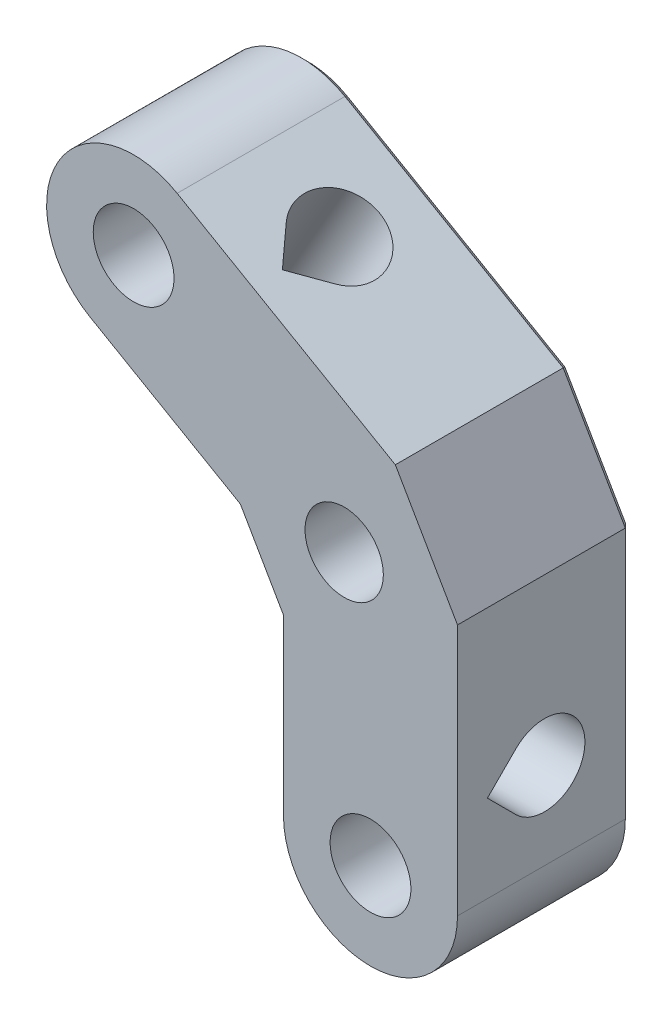
ISO-10303-21;
HEADER;
FILE_DESCRIPTION(('STEP AP214'),'2;1');
FILE_NAME('part.step','',(''),(''),'','','');
FILE_SCHEMA(('AUTOMOTIVE_DESIGN { 1 0 10303 214 1 1 1 1 }'));
ENDSEC;
DATA;
#1=APPLICATION_CONTEXT('core data for automotive mechanical design processes');
#2=APPLICATION_PROTOCOL_DEFINITION('international standard','automotive_design',2000,#1);
#3=PRODUCT_CONTEXT('',#1,'mechanical');
#4=PRODUCT('Part','Part','',(#3));
#5=PRODUCT_RELATED_PRODUCT_CATEGORY('part','',(#4));
#6=PRODUCT_DEFINITION_FORMATION('','',#4);
#7=PRODUCT_DEFINITION_CONTEXT('part definition',#1,'design');
#8=PRODUCT_DEFINITION('design','',#6,#7);
#9=PRODUCT_DEFINITION_SHAPE('','',#8);
#10=(LENGTH_UNIT() NAMED_UNIT(*) SI_UNIT(.MILLI.,.METRE.));
#11=(NAMED_UNIT(*) PLANE_ANGLE_UNIT() SI_UNIT($,.RADIAN.));
#12=(NAMED_UNIT(*) SI_UNIT($,.STERADIAN.) SOLID_ANGLE_UNIT());
#13=UNCERTAINTY_MEASURE_WITH_UNIT(LENGTH_MEASURE(1.E-05),#10,'distance_accuracy_value','');
#14=(GEOMETRIC_REPRESENTATION_CONTEXT(3) GLOBAL_UNCERTAINTY_ASSIGNED_CONTEXT((#13)) GLOBAL_UNIT_ASSIGNED_CONTEXT((#10,
#11,#12)) REPRESENTATION_CONTEXT('',''));
#15=CARTESIAN_POINT('',(0.,0.,0.));
#16=DIRECTION('',(0.,0.,1.));
#17=DIRECTION('',(1.,0.,0.));
#18=AXIS2_PLACEMENT_3D('',#15,#16,#17);
#19=CARTESIAN_POINT('',(1.76659838198365E-13,2.35810055605255E-13,0.));
#20=DIRECTION('',(0.,0.,1.));
#21=DIRECTION('',(1.,0.,0.));
#22=AXIS2_PLACEMENT_3D('',#19,#20,#21);
#23=CYLINDRICAL_SURFACE('',#22,7.);
#24=DIRECTION('',(0.,0.,1.));
#25=VECTOR('',#24,1.);
#26=CARTESIAN_POINT('',(-6.99999999999982,2.35810055605255E-13,0.));
#27=LINE('',#26,#25);
#28=CARTESIAN_POINT('',(-6.99999999999982,2.35810055605255E-13,0.5));
#29=VERTEX_POINT('',#28);
#30=CARTESIAN_POINT('',(-6.99999999999982,2.35810055605255E-13,14.));
#31=VERTEX_POINT('',#30);
#32=EDGE_CURVE('E244',#29,#31,#27,.T.);
#33=ORIENTED_EDGE('',*,*,#32,.F.);
#34=CARTESIAN_POINT('',(1.76659838198365E-13,2.35810055605255E-13,0.5));
#35=DIRECTION('',(0.,0.,1.));
#36=DIRECTION('',(1.,0.,0.));
#37=AXIS2_PLACEMENT_3D('',#34,#35,#36);
#38=CIRCLE('',#37,7.);
#39=CARTESIAN_POINT('',(7.00000000000018,2.35810055605255E-13,0.5));
#40=VERTEX_POINT('',#39);
#41=EDGE_CURVE('E297',#29,#40,#38,.T.);
#42=ORIENTED_EDGE('',*,*,#41,.T.);
#43=DIRECTION('',(0.,0.,1.));
#44=VECTOR('',#43,1.);
#45=CARTESIAN_POINT('',(7.00000000000018,2.35810055605255E-13,0.));
#46=LINE('',#45,#44);
#47=CARTESIAN_POINT('',(7.00000000000018,2.35810055605255E-13,14.));
#48=VERTEX_POINT('',#47);
#49=EDGE_CURVE('E243',#40,#48,#46,.T.);
#50=ORIENTED_EDGE('',*,*,#49,.T.);
#51=CARTESIAN_POINT('',(1.76659838198365E-13,2.35810055605255E-13,14.));
#52=DIRECTION('',(0.,0.,1.));
#53=DIRECTION('',(1.,0.,0.));
#54=AXIS2_PLACEMENT_3D('',#51,#52,#53);
#55=CIRCLE('',#54,7.);
#56=EDGE_CURVE('E219',#31,#48,#55,.T.);
#57=ORIENTED_EDGE('',*,*,#56,.F.);
#58=EDGE_LOOP('',(#33,#42,#50,#57));
#59=FACE_BOUND('',#58,.T.);
#60=ADVANCED_FACE('F34',(#59),#23,.T.);
#61=CARTESIAN_POINT('',(-6.9999999999999,13.9585481156721,0.));
#62=DIRECTION('',(-1.,0.,0.));
#63=DIRECTION('',(0.,-1.,0.));
#64=AXIS2_PLACEMENT_3D('',#61,#62,#63);
#65=PLANE('',#64);
#66=CARTESIAN_POINT('',(-6.99999999999982,6.99999999999998,7.));
#67=DIRECTION('',(-1.,0.,0.));
#68=DIRECTION('',(0.,-1.,0.));
#69=AXIS2_PLACEMENT_3D('',#66,#67,#68);
#70=CIRCLE('',#69,3.25);
#71=CARTESIAN_POINT('',(-6.99999999999982,9.29809703885623,9.29809703885627));
#72=VERTEX_POINT('',#71);
#73=CARTESIAN_POINT('',(-6.99999999999985,4.70190296114367,9.29809703885628));
#74=VERTEX_POINT('',#73);
#75=EDGE_CURVE('E169',#72,#74,#70,.T.);
#76=ORIENTED_EDGE('',*,*,#75,.F.);
#77=DIRECTION('',(0.,0.707106781186546,-0.707106781186549));
#78=VECTOR('',#77,1.);
#79=CARTESIAN_POINT('',(-6.99999999999982,6.99999999999995,11.5961940777126));
#80=LINE('',#79,#78);
#81=CARTESIAN_POINT('',(-6.99999999999982,6.99999999999995,11.5961940777126));
#82=VERTEX_POINT('',#81);
#83=EDGE_CURVE('E184',#82,#72,#80,.T.);
#84=ORIENTED_EDGE('',*,*,#83,.F.);
#85=DIRECTION('',(0.,0.707106781186549,0.707106781186546));
#86=VECTOR('',#85,1.);
#87=CARTESIAN_POINT('',(-6.99999999999982,4.70190296114367,9.29809703885628));
#88=LINE('',#87,#86);
#89=EDGE_CURVE('E187',#74,#82,#88,.T.);
#90=ORIENTED_EDGE('',*,*,#89,.F.);
#91=EDGE_LOOP('',(#76,#84,#90));
#92=FACE_BOUND('',#91,.T.);
#93=DIRECTION('',(0.,0.,1.));
#94=VECTOR('',#93,1.);
#95=CARTESIAN_POINT('',(-6.9999999999999,13.9585481156721,0.));
#96=LINE('',#95,#94);
#97=CARTESIAN_POINT('',(-6.9999999999999,13.9585481156721,0.500000000000001));
#98=VERTEX_POINT('',#97);
#99=CARTESIAN_POINT('',(-6.9999999999999,13.9585481156721,14.));
#100=VERTEX_POINT('',#99);
#101=EDGE_CURVE('E247',#98,#100,#96,.T.);
#102=ORIENTED_EDGE('',*,*,#101,.F.);
#103=DIRECTION('',(0.,-1.,0.));
#104=VECTOR('',#103,1.);
#105=CARTESIAN_POINT('',(-6.99999999999982,2.35810055605255E-13,0.5));
#106=LINE('',#105,#104);
#107=EDGE_CURVE('E299',#98,#29,#106,.T.);
#108=ORIENTED_EDGE('',*,*,#107,.T.);
#109=ORIENTED_EDGE('',*,*,#32,.T.);
#110=DIRECTION('',(0.,-1.,0.));
#111=VECTOR('',#110,1.);
#112=CARTESIAN_POINT('',(-6.9999999999999,13.9585481156721,14.));
#113=LINE('',#112,#111);
#114=EDGE_CURVE('E240',#100,#31,#113,.T.);
#115=ORIENTED_EDGE('',*,*,#114,.F.);
#116=EDGE_LOOP('',(#102,#108,#109,#115));
#117=FACE_BOUND('',#116,.T.);
#118=ADVANCED_FACE('F380',(#92,#117),#65,.T.);
#119=CARTESIAN_POINT('',(-10.4641016151382,19.9585481156731,0.));
#120=DIRECTION('',(-0.866025403784439,-0.5,0.));
#121=DIRECTION('',(0.5,-0.866025403784439,0.));
#122=AXIS2_PLACEMENT_3D('',#119,#120,#121);
#123=PLANE('',#122);
#124=DIRECTION('',(0.,0.,1.));
#125=VECTOR('',#124,1.);
#126=CARTESIAN_POINT('',(-10.4641016151382,19.9585481156731,0.));
#127=LINE('',#126,#125);
#128=CARTESIAN_POINT('',(-10.4641016151382,19.9585481156731,0.5));
#129=VERTEX_POINT('',#128);
#130=CARTESIAN_POINT('',(-10.4641016151382,19.9585481156731,14.));
#131=VERTEX_POINT('',#130);
#132=EDGE_CURVE('E249',#129,#131,#127,.T.);
#133=ORIENTED_EDGE('',*,*,#132,.F.);
#134=DIRECTION('',(0.5,-0.866025403784439,0.));
#135=VECTOR('',#134,1.);
#136=CARTESIAN_POINT('',(-6.9999999999999,13.9585481156721,0.500000000000001));
#137=LINE('',#136,#135);
#138=EDGE_CURVE('E301',#129,#98,#137,.T.);
#139=ORIENTED_EDGE('',*,*,#138,.T.);
#140=ORIENTED_EDGE('',*,*,#101,.T.);
#141=DIRECTION('',(0.5,-0.866025403784439,0.));
#142=VECTOR('',#141,1.);
#143=CARTESIAN_POINT('',(-10.4641016151382,19.9585481156731,14.));
#144=LINE('',#143,#142);
#145=EDGE_CURVE('E237',#131,#100,#144,.T.);
#146=ORIENTED_EDGE('',*,*,#145,.F.);
#147=EDGE_LOOP('',(#133,#139,#140,#146));
#148=FACE_BOUND('',#147,.T.);
#149=ADVANCED_FACE('F403',(#148),#123,.T.);
#150=CARTESIAN_POINT('',(-22.5525588832574,26.9378221735091,0.));
#151=DIRECTION('',(-0.500000000000008,-0.866025403784434,0.));
#152=DIRECTION('',(0.866025403784434,-0.500000000000008,0.));
#153=AXIS2_PLACEMENT_3D('',#150,#151,#152);
#154=PLANE('',#153);
#155=DIRECTION('',(-0.612372435695795,0.353553390593271,0.707106781186549));
#156=VECTOR('',#155,1.);
#157=CARTESIAN_POINT('',(-14.5000823158688,22.2887226596838,9.29809703885627));
#158=LINE('',#157,#156);
#159=CARTESIAN_POINT('',(-14.5000823158688,22.2887226596838,9.29809703885628));
#160=VERTEX_POINT('',#159);
#161=CARTESIAN_POINT('',(-16.49029273188,23.4377711791121,11.5961940777126));
#162=VERTEX_POINT('',#161);
#163=EDGE_CURVE('E197',#160,#162,#158,.T.);
#164=ORIENTED_EDGE('',*,*,#163,.F.);
#165=CARTESIAN_POINT('',(-16.4902927318801,23.4377711791119,7.));
#166=DIRECTION('',(-0.499999999999998,-0.86602540378444,0.));
#167=DIRECTION('',(0.86602540378444,-0.499999999999998,0.));
#168=AXIS2_PLACEMENT_3D('',#165,#166,#167);
#169=CIRCLE('',#168,3.25);
#170=CARTESIAN_POINT('',(-18.4805031478915,24.58681969854,9.29809703885628));
#171=VERTEX_POINT('',#170);
#172=EDGE_CURVE('E203',#171,#160,#169,.T.);
#173=ORIENTED_EDGE('',*,*,#172,.F.);
#174=DIRECTION('',(-0.612372435695796,0.353553390593272,-0.707106781186547));
#175=VECTOR('',#174,1.);
#176=CARTESIAN_POINT('',(-16.4902927318801,23.4377711791119,11.5961940777126));
#177=LINE('',#176,#175);
#178=EDGE_CURVE('E200',#162,#171,#177,.T.);
#179=ORIENTED_EDGE('',*,*,#178,.F.);
#180=EDGE_LOOP('',(#164,#173,#179));
#181=FACE_BOUND('',#180,.T.);
#182=DIRECTION('',(0.,0.,1.));
#183=VECTOR('',#182,1.);
#184=CARTESIAN_POINT('',(-22.5525588832574,26.9378221735091,0.));
#185=LINE('',#184,#183);
#186=CARTESIAN_POINT('',(-22.5525588832574,26.9378221735091,0.5));
#187=VERTEX_POINT('',#186);
#188=CARTESIAN_POINT('',(-22.5525588832574,26.9378221735091,14.));
#189=VERTEX_POINT('',#188);
#190=EDGE_CURVE('E251',#187,#189,#185,.T.);
#191=ORIENTED_EDGE('',*,*,#190,.F.);
#192=DIRECTION('',(0.866025403784434,-0.500000000000008,0.));
#193=VECTOR('',#192,1.);
#194=CARTESIAN_POINT('',(-10.4641016151382,19.9585481156731,0.5));
#195=LINE('',#194,#193);
#196=EDGE_CURVE('E303',#187,#129,#195,.T.);
#197=ORIENTED_EDGE('',*,*,#196,.T.);
#198=ORIENTED_EDGE('',*,*,#132,.T.);
#199=DIRECTION('',(0.866025403784434,-0.500000000000008,0.));
#200=VECTOR('',#199,1.);
#201=CARTESIAN_POINT('',(-22.5525588832574,26.9378221735091,14.));
#202=LINE('',#201,#200);
#203=EDGE_CURVE('E234',#189,#131,#202,.T.);
#204=ORIENTED_EDGE('',*,*,#203,.F.);
#205=EDGE_LOOP('',(#191,#197,#198,#204));
#206=FACE_BOUND('',#205,.T.);
#207=ADVANCED_FACE('F374',(#181,#206),#154,.T.);
#208=CARTESIAN_POINT('',(-19.0525588832574,33.0000000000002,0.));
#209=DIRECTION('',(0.,0.,1.));
#210=DIRECTION('',(1.,0.,0.));
#211=AXIS2_PLACEMENT_3D('',#208,#209,#210);
#212=CYLINDRICAL_SURFACE('',#211,7.);
#213=DIRECTION('',(0.,0.,1.));
#214=VECTOR('',#213,1.);
#215=CARTESIAN_POINT('',(-15.5525588832575,39.0621778264913,0.));
#216=LINE('',#215,#214);
#217=CARTESIAN_POINT('',(-15.5525588832575,39.0621778264913,0.500000000000002));
#218=VERTEX_POINT('',#217);
#219=CARTESIAN_POINT('',(-15.5525588832575,39.0621778264913,14.));
#220=VERTEX_POINT('',#219);
#221=EDGE_CURVE('E253',#218,#220,#216,.T.);
#222=ORIENTED_EDGE('',*,*,#221,.F.);
#223=CARTESIAN_POINT('',(-19.0525588832574,33.0000000000002,0.5));
#224=DIRECTION('',(0.,0.,1.));
#225=DIRECTION('',(1.,0.,0.));
#226=AXIS2_PLACEMENT_3D('',#223,#224,#225);
#227=CIRCLE('',#226,7.);
#228=EDGE_CURVE('E58',#218,#187,#227,.T.);
#229=ORIENTED_EDGE('',*,*,#228,.T.);
#230=ORIENTED_EDGE('',*,*,#190,.T.);
#231=CARTESIAN_POINT('',(-19.0525588832574,33.0000000000002,14.));
#232=DIRECTION('',(0.,0.,1.));
#233=DIRECTION('',(1.,0.,0.));
#234=AXIS2_PLACEMENT_3D('',#231,#232,#233);
#235=CIRCLE('',#234,7.);
#236=EDGE_CURVE('E231',#220,#189,#235,.T.);
#237=ORIENTED_EDGE('',*,*,#236,.F.);
#238=EDGE_LOOP('',(#222,#229,#230,#237));
#239=FACE_BOUND('',#238,.T.);
#240=ADVANCED_FACE('F371',(#239),#212,.T.);
#241=CARTESIAN_POINT('',(2.00000000000025,28.9282032302758,0.));
#242=DIRECTION('',(0.499999999999997,0.86602540378444,0.));
#243=DIRECTION('',(-0.866025403784441,0.499999999999997,0.));
#244=AXIS2_PLACEMENT_3D('',#241,#242,#243);
#245=PLANE('',#244);
#246=DIRECTION('',(0.612372435695795,-0.353553390593271,-0.707106781186549));
#247=VECTOR('',#246,1.);
#248=CARTESIAN_POINT('',(1.276152963317,29.346116511757,-0.835826562962364));
#249=LINE('',#248,#247);
#250=CARTESIAN_POINT('',(-9.49029273187996,35.5621268320944,11.5961940777126));
#251=VERTEX_POINT('',#250);
#252=CARTESIAN_POINT('',(-7.50008231586863,34.4130783126663,9.29809703885628));
#253=VERTEX_POINT('',#252);
#254=EDGE_CURVE('E264',#251,#253,#249,.T.);
#255=ORIENTED_EDGE('',*,*,#254,.F.);
#256=DIRECTION('',(0.612372435695796,-0.353553390593272,0.707106781186547));
#257=VECTOR('',#256,1.);
#258=CARTESIAN_POINT('',(-8.76644569519673,35.1442135506132,12.4320206406749));
#259=LINE('',#258,#257);
#260=CARTESIAN_POINT('',(-11.4805031478913,36.7111753515225,9.29809703885628));
#261=VERTEX_POINT('',#260);
#262=EDGE_CURVE('E246',#261,#251,#259,.T.);
#263=ORIENTED_EDGE('',*,*,#262,.F.);
#264=CARTESIAN_POINT('',(-9.49029273187996,35.5621268320944,7.));
#265=DIRECTION('',(0.499999999999997,0.86602540378444,0.));
#266=DIRECTION('',(-0.866025403784441,0.499999999999997,0.));
#267=AXIS2_PLACEMENT_3D('',#264,#265,#266);
#268=CIRCLE('',#267,3.25);
#269=EDGE_CURVE('E261',#253,#261,#268,.T.);
#270=ORIENTED_EDGE('',*,*,#269,.F.);
#271=EDGE_LOOP('',(#255,#263,#270));
#272=FACE_BOUND('',#271,.T.);
#273=DIRECTION('',(0.,0.,1.));
#274=VECTOR('',#273,1.);
#275=CARTESIAN_POINT('',(2.00000000000025,28.9282032302758,0.));
#276=LINE('',#275,#274);
#277=CARTESIAN_POINT('',(2.00000000000025,28.9282032302758,0.500000000000002));
#278=VERTEX_POINT('',#277);
#279=CARTESIAN_POINT('',(2.00000000000025,28.9282032302758,14.));
#280=VERTEX_POINT('',#279);
#281=EDGE_CURVE('E255',#278,#280,#276,.T.);
#282=ORIENTED_EDGE('',*,*,#281,.F.);
#283=DIRECTION('',(-0.866025403784441,0.499999999999997,0.));
#284=VECTOR('',#283,1.);
#285=CARTESIAN_POINT('',(-15.5525588832575,39.0621778264913,0.500000000000002));
#286=LINE('',#285,#284);
#287=EDGE_CURVE('E51',#278,#218,#286,.T.);
#288=ORIENTED_EDGE('',*,*,#287,.T.);
#289=ORIENTED_EDGE('',*,*,#221,.T.);
#290=DIRECTION('',(-0.86602540378444,0.499999999999997,0.));
#291=VECTOR('',#290,1.);
#292=CARTESIAN_POINT('',(2.00000000000025,28.9282032302758,14.));
#293=LINE('',#292,#291);
#294=EDGE_CURVE('E228',#280,#220,#293,.T.);
#295=ORIENTED_EDGE('',*,*,#294,.F.);
#296=EDGE_LOOP('',(#282,#288,#289,#295));
#297=FACE_BOUND('',#296,.T.);
#298=ADVANCED_FACE('F370',(#272,#297),#245,.T.);
#299=CARTESIAN_POINT('',(7.00000000000016,20.2679491924314,0.));
#300=DIRECTION('',(0.866025403784444,0.499999999999991,0.));
#301=DIRECTION('',(-0.499999999999991,0.866025403784444,0.));
#302=AXIS2_PLACEMENT_3D('',#299,#300,#301);
#303=PLANE('',#302);
#304=DIRECTION('',(0.,0.,1.));
#305=VECTOR('',#304,1.);
#306=CARTESIAN_POINT('',(7.00000000000016,20.2679491924314,0.));
#307=LINE('',#306,#305);
#308=CARTESIAN_POINT('',(7.00000000000016,20.2679491924314,0.5));
#309=VERTEX_POINT('',#308);
#310=CARTESIAN_POINT('',(7.00000000000016,20.2679491924314,14.));
#311=VERTEX_POINT('',#310);
#312=EDGE_CURVE('E257',#309,#311,#307,.T.);
#313=ORIENTED_EDGE('',*,*,#312,.F.);
#314=DIRECTION('',(-0.499999999999991,0.866025403784444,0.));
#315=VECTOR('',#314,1.);
#316=CARTESIAN_POINT('',(2.00000000000025,28.9282032302758,0.500000000000001));
#317=LINE('',#316,#315);
#318=EDGE_CURVE('E266',#309,#278,#317,.T.);
#319=ORIENTED_EDGE('',*,*,#318,.T.);
#320=ORIENTED_EDGE('',*,*,#281,.T.);
#321=DIRECTION('',(-0.499999999999991,0.866025403784444,0.));
#322=VECTOR('',#321,1.);
#323=CARTESIAN_POINT('',(7.00000000000016,20.2679491924314,14.));
#324=LINE('',#323,#322);
#325=EDGE_CURVE('E225',#311,#280,#324,.T.);
#326=ORIENTED_EDGE('',*,*,#325,.F.);
#327=EDGE_LOOP('',(#313,#319,#320,#326));
#328=FACE_BOUND('',#327,.T.);
#329=ADVANCED_FACE('F367',(#328),#303,.T.);
#330=CARTESIAN_POINT('',(7.00000000000018,2.35810055605255E-13,0.));
#331=DIRECTION('',(1.,0.,0.));
#332=DIRECTION('',(0.,1.,0.));
#333=AXIS2_PLACEMENT_3D('',#330,#331,#332);
#334=PLANE('',#333);
#335=CARTESIAN_POINT('',(7.00000000000018,6.99999999999998,7.));
#336=DIRECTION('',(-1.,0.,0.));
#337=DIRECTION('',(0.,-1.,0.));
#338=AXIS2_PLACEMENT_3D('',#335,#336,#337);
#339=CIRCLE('',#338,3.25);
#340=CARTESIAN_POINT('',(7.00000000000018,9.29809703885623,9.29809703885627));
#341=VERTEX_POINT('',#340);
#342=CARTESIAN_POINT('',(7.00000000000018,4.70190296114367,9.29809703885628));
#343=VERTEX_POINT('',#342);
#344=EDGE_CURVE('E166',#341,#343,#339,.T.);
#345=ORIENTED_EDGE('',*,*,#344,.T.);
#346=DIRECTION('',(0.,0.707106781186549,0.707106781186546));
#347=VECTOR('',#346,1.);
#348=CARTESIAN_POINT('',(7.00000000000018,4.70190296114367,9.29809703885628));
#349=LINE('',#348,#347);
#350=CARTESIAN_POINT('',(7.00000000000017,6.99999999999995,11.5961940777126));
#351=VERTEX_POINT('',#350);
#352=EDGE_CURVE('E178',#343,#351,#349,.T.);
#353=ORIENTED_EDGE('',*,*,#352,.T.);
#354=DIRECTION('',(0.,0.707106781186546,-0.707106781186549));
#355=VECTOR('',#354,1.);
#356=CARTESIAN_POINT('',(7.00000000000018,6.99999999999995,11.5961940777126));
#357=LINE('',#356,#355);
#358=EDGE_CURVE('E174',#351,#341,#357,.T.);
#359=ORIENTED_EDGE('',*,*,#358,.T.);
#360=EDGE_LOOP('',(#345,#353,#359));
#361=FACE_BOUND('',#360,.T.);
#362=ORIENTED_EDGE('',*,*,#49,.F.);
#363=DIRECTION('',(0.,1.,0.));
#364=VECTOR('',#363,1.);
#365=CARTESIAN_POINT('',(7.00000000000016,20.2679491924314,0.5));
#366=LINE('',#365,#364);
#367=EDGE_CURVE('E295',#40,#309,#366,.T.);
#368=ORIENTED_EDGE('',*,*,#367,.T.);
#369=ORIENTED_EDGE('',*,*,#312,.T.);
#370=DIRECTION('',(0.,1.,0.));
#371=VECTOR('',#370,1.);
#372=CARTESIAN_POINT('',(7.00000000000018,2.35810055605255E-13,14.));
#373=LINE('',#372,#371);
#374=EDGE_CURVE('E222',#48,#311,#373,.T.);
#375=ORIENTED_EDGE('',*,*,#374,.F.);
#376=EDGE_LOOP('',(#362,#368,#369,#375));
#377=FACE_BOUND('',#376,.T.);
#378=ADVANCED_FACE('F182',(#361,#377),#334,.T.);
#379=CARTESIAN_POINT('',(1.76659838198365E-13,2.35810055605255E-13,0.));
#380=DIRECTION('',(0.,0.,1.));
#381=DIRECTION('',(1.,0.,0.));
#382=AXIS2_PLACEMENT_3D('',#379,#380,#381);
#383=PLANE('',#382);
#384=DIRECTION('',(0.86602540378444,-0.499999999999997,0.));
#385=VECTOR('',#384,1.);
#386=CARTESIAN_POINT('',(1.75000000000024,28.4951905283836,0.));
#387=LINE('',#386,#385);
#388=CARTESIAN_POINT('',(-15.8025588832575,38.6291651245991,0.));
#389=VERTEX_POINT('',#388);
#390=CARTESIAN_POINT('',(1.63397459621581,28.5621778264914,0.));
#391=VERTEX_POINT('',#390);
#392=EDGE_CURVE('E278',#389,#391,#387,.T.);
#393=ORIENTED_EDGE('',*,*,#392,.T.);
#394=DIRECTION('',(0.499999999999991,-0.866025403784444,0.));
#395=VECTOR('',#394,1.);
#396=CARTESIAN_POINT('',(6.56698729810793,20.0179491924314,0.));
#397=LINE('',#396,#395);
#398=CARTESIAN_POINT('',(6.50000000000015,20.1339745962158,0.));
#399=VERTEX_POINT('',#398);
#400=EDGE_CURVE('E292',#391,#399,#397,.T.);
#401=ORIENTED_EDGE('',*,*,#400,.T.);
#402=DIRECTION('',(0.,-1.,0.));
#403=VECTOR('',#402,1.);
#404=CARTESIAN_POINT('',(6.50000000000017,2.35317916026053E-13,0.));
#405=LINE('',#404,#403);
#406=CARTESIAN_POINT('',(6.50000000000017,2.35317916026053E-13,0.));
#407=VERTEX_POINT('',#406);
#408=EDGE_CURVE('E290',#399,#407,#405,.T.);
#409=ORIENTED_EDGE('',*,*,#408,.T.);
#410=CARTESIAN_POINT('',(1.76659838198365E-13,2.35810055605255E-13,0.));
#411=DIRECTION('',(0.,0.,1.));
#412=DIRECTION('',(1.,0.,0.));
#413=AXIS2_PLACEMENT_3D('',#410,#411,#412);
#414=CIRCLE('',#413,6.5);
#415=CARTESIAN_POINT('',(-6.49999999999982,2.35810055605255E-13,0.));
#416=VERTEX_POINT('',#415);
#417=EDGE_CURVE('E288',#407,#416,#414,.F.);
#418=ORIENTED_EDGE('',*,*,#417,.T.);
#419=DIRECTION('',(0.,1.,0.));
#420=VECTOR('',#419,1.);
#421=CARTESIAN_POINT('',(-6.4999999999999,13.9585481156721,0.));
#422=LINE('',#421,#420);
#423=CARTESIAN_POINT('',(-6.4999999999999,14.0925227118877,0.));
#424=VERTEX_POINT('',#423);
#425=EDGE_CURVE('E286',#416,#424,#422,.T.);
#426=ORIENTED_EDGE('',*,*,#425,.T.);
#427=DIRECTION('',(-0.5,0.866025403784439,0.));
#428=VECTOR('',#427,1.);
#429=CARTESIAN_POINT('',(-10.031088913246,20.2085481156731,0.));
#430=LINE('',#429,#428);
#431=CARTESIAN_POINT('',(-10.0980762113538,20.3245735194575,0.));
#432=VERTEX_POINT('',#431);
#433=EDGE_CURVE('E284',#424,#432,#430,.T.);
#434=ORIENTED_EDGE('',*,*,#433,.T.);
#435=DIRECTION('',(-0.866025403784434,0.500000000000008,0.));
#436=VECTOR('',#435,1.);
#437=CARTESIAN_POINT('',(-22.3025588832574,27.3708348754014,0.));
#438=LINE('',#437,#436);
#439=CARTESIAN_POINT('',(-22.3025588832574,27.3708348754014,0.));
#440=VERTEX_POINT('',#439);
#441=EDGE_CURVE('E282',#432,#440,#438,.T.);
#442=ORIENTED_EDGE('',*,*,#441,.T.);
#443=CARTESIAN_POINT('',(-19.0525588832574,33.0000000000002,0.));
#444=DIRECTION('',(0.,0.,1.));
#445=DIRECTION('',(1.,0.,0.));
#446=AXIS2_PLACEMENT_3D('',#443,#444,#445);
#447=CIRCLE('',#446,6.5);
#448=EDGE_CURVE('E280',#440,#389,#447,.F.);
#449=ORIENTED_EDGE('',*,*,#448,.T.);
#450=EDGE_LOOP('',(#393,#401,#409,#418,#426,#434,#442,#449));
#451=FACE_BOUND('',#450,.T.);
#452=CARTESIAN_POINT('',(0.,0.,0.));
#453=DIRECTION('',(0.,0.,1.));
#454=DIRECTION('',(1.,0.,0.));
#455=AXIS2_PLACEMENT_3D('',#452,#453,#454);
#456=CIRCLE('',#455,3.75000000000002);
#457=CARTESIAN_POINT('',(3.75000000000002,0.,0.));
#458=VERTEX_POINT('',#457);
#459=EDGE_CURVE('E275',#458,#458,#456,.T.);
#460=ORIENTED_EDGE('',*,*,#459,.T.);
#461=EDGE_LOOP('',(#460));
#462=FACE_BOUND('',#461,.T.);
#463=CARTESIAN_POINT('',(-2.11602540378443,20.7783121635131,0.));
#464=DIRECTION('',(0.,0.,1.));
#465=DIRECTION('',(1.,0.,0.));
#466=AXIS2_PLACEMENT_3D('',#463,#464,#465);
#467=CIRCLE('',#466,3.65000000000001);
#468=CARTESIAN_POINT('',(1.53397459621558,20.7783121635131,0.));
#469=VERTEX_POINT('',#468);
#470=EDGE_CURVE('E272',#469,#469,#467,.T.);
#471=ORIENTED_EDGE('',*,*,#470,.T.);
#472=EDGE_LOOP('',(#471));
#473=FACE_BOUND('',#472,.T.);
#474=CARTESIAN_POINT('',(-19.0525,32.999898011206,0.));
#475=DIRECTION('',(0.,0.,1.));
#476=DIRECTION('',(1.,0.,0.));
#477=AXIS2_PLACEMENT_3D('',#474,#475,#476);
#478=CIRCLE('',#477,3.75000000000001);
#479=CARTESIAN_POINT('',(-15.3025,32.999898011206,0.));
#480=VERTEX_POINT('',#479);
#481=EDGE_CURVE('E269',#480,#480,#478,.T.);
#482=ORIENTED_EDGE('',*,*,#481,.T.);
#483=EDGE_LOOP('',(#482));
#484=FACE_BOUND('',#483,.T.);
#485=ADVANCED_FACE('F347',(#451,#462,#473,#484),#383,.F.);
#486=CARTESIAN_POINT('',(1.76659838198365E-13,2.35810055605255E-13,14.));
#487=DIRECTION('',(0.,0.,1.));
#488=DIRECTION('',(1.,0.,0.));
#489=AXIS2_PLACEMENT_3D('',#486,#487,#488);
#490=PLANE('',#489);
#491=CARTESIAN_POINT('',(-2.11602540378443,20.7783121635131,14.));
#492=DIRECTION('',(0.,0.,1.));
#493=DIRECTION('',(1.,0.,0.));
#494=AXIS2_PLACEMENT_3D('',#491,#492,#493);
#495=CIRCLE('',#494,3.15);
#496=CARTESIAN_POINT('',(1.03397459621557,20.7783121635131,14.));
#497=VERTEX_POINT('',#496);
#498=EDGE_CURVE('E190',#497,#497,#495,.T.);
#499=ORIENTED_EDGE('',*,*,#498,.F.);
#500=EDGE_LOOP('',(#499));
#501=FACE_BOUND('',#500,.T.);
#502=CARTESIAN_POINT('',(-19.0525,32.999898011206,14.));
#503=DIRECTION('',(0.,0.,-1.));
#504=DIRECTION('',(-1.,0.,0.));
#505=AXIS2_PLACEMENT_3D('',#502,#503,#504);
#506=CIRCLE('',#505,3.25000000000001);
#507=CARTESIAN_POINT('',(-22.3025,32.999898011206,14.));
#508=VERTEX_POINT('',#507);
#509=EDGE_CURVE('E209',#508,#508,#506,.T.);
#510=ORIENTED_EDGE('',*,*,#509,.T.);
#511=EDGE_LOOP('',(#510));
#512=FACE_BOUND('',#511,.T.);
#513=CARTESIAN_POINT('',(0.,0.,14.));
#514=DIRECTION('',(0.,0.,-1.));
#515=DIRECTION('',(-1.,0.,0.));
#516=AXIS2_PLACEMENT_3D('',#513,#514,#515);
#517=CIRCLE('',#516,3.25000000000001);
#518=CARTESIAN_POINT('',(-3.25000000000001,0.,14.));
#519=VERTEX_POINT('',#518);
#520=EDGE_CURVE('E216',#519,#519,#517,.T.);
#521=ORIENTED_EDGE('',*,*,#520,.T.);
#522=EDGE_LOOP('',(#521));
#523=FACE_BOUND('',#522,.T.);
#524=ORIENTED_EDGE('',*,*,#56,.T.);
#525=ORIENTED_EDGE('',*,*,#374,.T.);
#526=ORIENTED_EDGE('',*,*,#325,.T.);
#527=ORIENTED_EDGE('',*,*,#294,.T.);
#528=ORIENTED_EDGE('',*,*,#236,.T.);
#529=ORIENTED_EDGE('',*,*,#203,.T.);
#530=ORIENTED_EDGE('',*,*,#145,.T.);
#531=ORIENTED_EDGE('',*,*,#114,.T.);
#532=EDGE_LOOP('',(#524,#525,#526,#527,#528,#529,#530,#531));
#533=FACE_BOUND('',#532,.T.);
#534=ADVANCED_FACE('F343',(#501,#512,#523,#533),#490,.T.);
#535=CARTESIAN_POINT('',(0.,0.,0.));
#536=DIRECTION('',(0.,0.,-1.));
#537=DIRECTION('',(-1.,0.,0.));
#538=AXIS2_PLACEMENT_3D('',#535,#536,#537);
#539=CYLINDRICAL_SURFACE('',#538,3.25000000000001);
#540=CARTESIAN_POINT('',(0.,0.,0.500000000000002));
#541=DIRECTION('',(0.,0.,1.));
#542=DIRECTION('',(1.,0.,0.));
#543=AXIS2_PLACEMENT_3D('',#540,#541,#542);
#544=CIRCLE('',#543,3.25000000000001);
#545=CARTESIAN_POINT('',(3.25000000000001,0.,0.500000000000002));
#546=VERTEX_POINT('',#545);
#547=EDGE_CURVE('E307',#546,#546,#544,.F.);
#548=ORIENTED_EDGE('',*,*,#547,.T.);
#549=EDGE_LOOP('',(#548));
#550=FACE_BOUND('',#549,.T.);
#551=ORIENTED_EDGE('',*,*,#520,.F.);
#552=EDGE_LOOP('',(#551));
#553=FACE_BOUND('',#552,.T.);
#554=ADVANCED_FACE('F346',(#550,#553),#539,.F.);
#555=CARTESIAN_POINT('',(-19.0525,32.999898011206,0.));
#556=DIRECTION('',(0.,0.,-1.));
#557=DIRECTION('',(-1.,0.,0.));
#558=AXIS2_PLACEMENT_3D('',#555,#556,#557);
#559=CYLINDRICAL_SURFACE('',#558,3.25000000000001);
#560=CARTESIAN_POINT('',(-19.0525,32.999898011206,0.500000000000003));
#561=DIRECTION('',(0.,0.,1.));
#562=DIRECTION('',(1.,0.,0.));
#563=AXIS2_PLACEMENT_3D('',#560,#561,#562);
#564=CIRCLE('',#563,3.25000000000001);
#565=CARTESIAN_POINT('',(-15.8025,32.999898011206,0.500000000000003));
#566=VERTEX_POINT('',#565);
#567=EDGE_CURVE('E11',#566,#566,#564,.F.);
#568=ORIENTED_EDGE('',*,*,#567,.T.);
#569=EDGE_LOOP('',(#568));
#570=FACE_BOUND('',#569,.T.);
#571=ORIENTED_EDGE('',*,*,#509,.F.);
#572=EDGE_LOOP('',(#571));
#573=FACE_BOUND('',#572,.T.);
#574=ADVANCED_FACE('F422',(#570,#573),#559,.F.);
#575=CARTESIAN_POINT('',(-1.45585368180874,44.8819893994207,9.29809703885627));
#576=DIRECTION('',(0.612372435695796,-0.353553390593273,0.707106781186546));
#577=DIRECTION('',(0.755928946018453,0.,-0.654653670707979));
#578=AXIS2_PLACEMENT_3D('',#575,#576,#577);
#579=PLANE('',#578);
#580=ORIENTED_EDGE('',*,*,#254,.T.);
#581=DIRECTION('',(-0.499999999999998,-0.86602540378444,0.));
#582=VECTOR('',#581,1.);
#583=CARTESIAN_POINT('',(-1.45585368180874,44.8819893994207,9.29809703885628));
#584=LINE('',#583,#582);
#585=EDGE_CURVE('E207',#253,#160,#584,.T.);
#586=ORIENTED_EDGE('',*,*,#585,.T.);
#587=ORIENTED_EDGE('',*,*,#163,.T.);
#588=DIRECTION('',(-0.499999999999998,-0.86602540378444,0.));
#589=VECTOR('',#588,1.);
#590=CARTESIAN_POINT('',(-3.44606409782007,46.0310379188488,11.5961940777126));
#591=LINE('',#590,#589);
#592=EDGE_CURVE('E206',#251,#162,#591,.T.);
#593=ORIENTED_EDGE('',*,*,#592,.F.);
#594=EDGE_LOOP('',(#580,#586,#587,#593));
#595=FACE_BOUND('',#594,.T.);
#596=ADVANCED_FACE('F425',(#595),#579,.F.);
#597=CARTESIAN_POINT('',(-3.44606409782007,46.0310379188488,7.));
#598=DIRECTION('',(-0.499999999999998,-0.86602540378444,0.));
#599=DIRECTION('',(0.86602540378444,-0.499999999999998,0.));
#600=AXIS2_PLACEMENT_3D('',#597,#598,#599);
#601=CYLINDRICAL_SURFACE('',#600,3.25);
#602=ORIENTED_EDGE('',*,*,#269,.T.);
#603=DIRECTION('',(-0.499999999999998,-0.86602540378444,0.));
#604=VECTOR('',#603,1.);
#605=CARTESIAN_POINT('',(-5.43627451383141,47.1800864382769,9.29809703885628));
#606=LINE('',#605,#604);
#607=EDGE_CURVE('E210',#261,#171,#606,.T.);
#608=ORIENTED_EDGE('',*,*,#607,.T.);
#609=ORIENTED_EDGE('',*,*,#172,.T.);
#610=ORIENTED_EDGE('',*,*,#585,.F.);
#611=EDGE_LOOP('',(#602,#608,#609,#610));
#612=FACE_BOUND('',#611,.T.);
#613=ADVANCED_FACE('F431',(#612),#601,.F.);
#614=CARTESIAN_POINT('',(-3.44606409782007,46.0310379188488,11.5961940777126));
#615=DIRECTION('',(-0.612372435695795,0.353553390593272,0.707106781186548));
#616=DIRECTION('',(0.755928946018455,0.,0.654653670707977));
#617=AXIS2_PLACEMENT_3D('',#614,#615,#616);
#618=PLANE('',#617);
#619=ORIENTED_EDGE('',*,*,#262,.T.);
#620=ORIENTED_EDGE('',*,*,#592,.T.);
#621=ORIENTED_EDGE('',*,*,#178,.T.);
#622=ORIENTED_EDGE('',*,*,#607,.F.);
#623=EDGE_LOOP('',(#619,#620,#621,#622));
#624=FACE_BOUND('',#623,.T.);
#625=ADVANCED_FACE('F485',(#624),#618,.F.);
#626=CARTESIAN_POINT('',(7.00000000000018,6.99999999999998,7.));
#627=DIRECTION('',(-1.,0.,0.));
#628=DIRECTION('',(0.,-1.,0.));
#629=AXIS2_PLACEMENT_3D('',#626,#627,#628);
#630=CYLINDRICAL_SURFACE('',#629,3.25);
#631=ORIENTED_EDGE('',*,*,#75,.T.);
#632=DIRECTION('',(-1.,0.,0.));
#633=VECTOR('',#632,1.);
#634=CARTESIAN_POINT('',(7.00000000000018,4.70190296114367,9.29809703885628));
#635=LINE('',#634,#633);
#636=EDGE_CURVE('E162',#343,#74,#635,.T.);
#637=ORIENTED_EDGE('',*,*,#636,.F.);
#638=ORIENTED_EDGE('',*,*,#344,.F.);
#639=DIRECTION('',(-1.,0.,0.));
#640=VECTOR('',#639,1.);
#641=CARTESIAN_POINT('',(7.00000000000018,9.29809703885623,9.29809703885627));
#642=LINE('',#641,#640);
#643=EDGE_CURVE('E195',#341,#72,#642,.T.);
#644=ORIENTED_EDGE('',*,*,#643,.T.);
#645=EDGE_LOOP('',(#631,#637,#638,#644));
#646=FACE_BOUND('',#645,.T.);
#647=ADVANCED_FACE('F164',(#646),#630,.F.);
#648=CARTESIAN_POINT('',(7.00000000000018,6.99999999999995,11.5961940777126));
#649=DIRECTION('',(0.,0.707106781186549,0.707106781186546));
#650=DIRECTION('',(0.,-0.707106781186546,0.707106781186549));
#651=AXIS2_PLACEMENT_3D('',#648,#649,#650);
#652=PLANE('',#651);
#653=ORIENTED_EDGE('',*,*,#83,.T.);
#654=ORIENTED_EDGE('',*,*,#643,.F.);
#655=ORIENTED_EDGE('',*,*,#358,.F.);
#656=DIRECTION('',(-1.,0.,0.));
#657=VECTOR('',#656,1.);
#658=CARTESIAN_POINT('',(7.00000000000018,6.99999999999995,11.5961940777126));
#659=LINE('',#658,#657);
#660=EDGE_CURVE('E173',#351,#82,#659,.T.);
#661=ORIENTED_EDGE('',*,*,#660,.T.);
#662=EDGE_LOOP('',(#653,#654,#655,#661));
#663=FACE_BOUND('',#662,.T.);
#664=ADVANCED_FACE('F477',(#663),#652,.F.);
#665=CARTESIAN_POINT('',(7.00000000000018,4.70190296114367,9.29809703885628));
#666=DIRECTION('',(0.,-0.707106781186547,0.707106781186549));
#667=DIRECTION('',(0.,-0.707106781186549,-0.707106781186546));
#668=AXIS2_PLACEMENT_3D('',#665,#666,#667);
#669=PLANE('',#668);
#670=ORIENTED_EDGE('',*,*,#89,.T.);
#671=ORIENTED_EDGE('',*,*,#660,.F.);
#672=ORIENTED_EDGE('',*,*,#352,.F.);
#673=ORIENTED_EDGE('',*,*,#636,.T.);
#674=EDGE_LOOP('',(#670,#671,#672,#673));
#675=FACE_BOUND('',#674,.T.);
#676=ADVANCED_FACE('F179',(#675),#669,.F.);
#677=CARTESIAN_POINT('',(-2.11602540378443,20.7783121635131,0.));
#678=DIRECTION('',(0.,0.,1.));
#679=DIRECTION('',(1.,0.,0.));
#680=AXIS2_PLACEMENT_3D('',#677,#678,#679);
#681=CYLINDRICAL_SURFACE('',#680,3.15);
#682=CARTESIAN_POINT('',(-2.11602540378443,20.7783121635131,0.50000000000001));
#683=DIRECTION('',(0.,0.,1.));
#684=DIRECTION('',(1.,0.,0.));
#685=AXIS2_PLACEMENT_3D('',#682,#683,#684);
#686=CIRCLE('',#685,3.15);
#687=CARTESIAN_POINT('',(1.03397459621557,20.7783121635131,0.50000000000001));
#688=VERTEX_POINT('',#687);
#689=EDGE_CURVE('E43',#688,#688,#686,.F.);
#690=ORIENTED_EDGE('',*,*,#689,.T.);
#691=EDGE_LOOP('',(#690));
#692=FACE_BOUND('',#691,.T.);
#693=ORIENTED_EDGE('',*,*,#498,.T.);
#694=EDGE_LOOP('',(#693));
#695=FACE_BOUND('',#694,.T.);
#696=ADVANCED_FACE('F341',(#692,#695),#681,.F.);
#697=CARTESIAN_POINT('',(-10.4641016151382,19.9585481156731,0.5));
#698=DIRECTION('',(-0.612372435695792,-0.353553390593273,-0.70710678118655));
#699=DIRECTION('',(-0.5,0.866025403784439,0.));
#700=AXIS2_PLACEMENT_3D('',#697,#698,#699);
#701=PLANE('',#700);
#702=DIRECTION('',(-0.508589802709493,-0.508589802709468,0.694746590606866));
#703=VECTOR('',#702,1.);
#704=CARTESIAN_POINT('',(-10.4641016151382,19.9585481156731,0.5));
#705=LINE('',#704,#703);
#706=EDGE_CURVE('E327',#432,#129,#705,.T.);
#707=ORIENTED_EDGE('',*,*,#706,.F.);
#708=ORIENTED_EDGE('',*,*,#433,.F.);
#709=DIRECTION('',(-0.694746590606866,-0.186156787897392,0.694746590606864));
#710=VECTOR('',#709,1.);
#711=CARTESIAN_POINT('',(-6.9999999999999,13.9585481156721,0.500000000000001));
#712=LINE('',#711,#710);
#713=EDGE_CURVE('E38',#98,#424,#712,.F.);
#714=ORIENTED_EDGE('',*,*,#713,.F.);
#715=ORIENTED_EDGE('',*,*,#138,.F.);
#716=EDGE_LOOP('',(#707,#708,#714,#715));
#717=FACE_BOUND('',#716,.T.);
#718=ADVANCED_FACE('F405',(#717),#701,.T.);
#719=CARTESIAN_POINT('',(-6.9999999999999,13.9585481156721,0.5));
#720=DIRECTION('',(-0.707106781186546,0.,-0.707106781186549));
#721=DIRECTION('',(0.,1.,0.));
#722=AXIS2_PLACEMENT_3D('',#719,#720,#721);
#723=PLANE('',#722);
#724=ORIENTED_EDGE('',*,*,#713,.T.);
#725=ORIENTED_EDGE('',*,*,#425,.F.);
#726=DIRECTION('',(0.707106781186549,0.,-0.707106781186546));
#727=VECTOR('',#726,1.);
#728=CARTESIAN_POINT('',(-6.99999999999982,2.35810055605255E-13,0.5));
#729=LINE('',#728,#727);
#730=EDGE_CURVE('E325',#29,#416,#729,.T.);
#731=ORIENTED_EDGE('',*,*,#730,.F.);
#732=ORIENTED_EDGE('',*,*,#107,.F.);
#733=EDGE_LOOP('',(#724,#725,#731,#732));
#734=FACE_BOUND('',#733,.T.);
#735=ADVANCED_FACE('F381',(#734),#723,.T.);
#736=CARTESIAN_POINT('',(-22.5525588832574,26.9378221735091,0.5));
#737=DIRECTION('',(-0.35355339059328,-0.612372435695792,-0.707106781186546));
#738=DIRECTION('',(-0.866025403784434,0.500000000000008,0.));
#739=AXIS2_PLACEMENT_3D('',#736,#737,#738);
#740=PLANE('',#739);
#741=ORIENTED_EDGE('',*,*,#706,.T.);
#742=ORIENTED_EDGE('',*,*,#196,.F.);
#743=DIRECTION('',(-0.353553390593279,-0.612372435695792,0.707106781186547));
#744=VECTOR('',#743,1.);
#745=CARTESIAN_POINT('',(-22.3025588832574,27.3708348754014,0.));
#746=LINE('',#745,#744);
#747=EDGE_CURVE('E322',#440,#187,#746,.T.);
#748=ORIENTED_EDGE('',*,*,#747,.F.);
#749=ORIENTED_EDGE('',*,*,#441,.F.);
#750=EDGE_LOOP('',(#741,#742,#748,#749));
#751=FACE_BOUND('',#750,.T.);
#752=ADVANCED_FACE('F401',(#751),#740,.T.);
#753=CARTESIAN_POINT('',(1.76659838198365E-13,2.35810055605255E-13,0.5));
#754=DIRECTION('',(0.,0.,1.));
#755=DIRECTION('',(1.,0.,0.));
#756=AXIS2_PLACEMENT_3D('',#753,#754,#755);
#757=CONICAL_SURFACE('',#756,7.,0.78539816339745);
#758=ORIENTED_EDGE('',*,*,#730,.T.);
#759=ORIENTED_EDGE('',*,*,#417,.F.);
#760=DIRECTION('',(-0.707106781186549,0.,-0.707106781186546));
#761=VECTOR('',#760,1.);
#762=CARTESIAN_POINT('',(7.00000000000018,2.35810055605255E-13,0.5));
#763=LINE('',#762,#761);
#764=EDGE_CURVE('E319',#40,#407,#763,.T.);
#765=ORIENTED_EDGE('',*,*,#764,.F.);
#766=ORIENTED_EDGE('',*,*,#41,.F.);
#767=EDGE_LOOP('',(#758,#759,#765,#766));
#768=FACE_BOUND('',#767,.T.);
#769=ADVANCED_FACE('F384',(#768),#757,.T.);
#770=CARTESIAN_POINT('',(-19.0525588832574,33.0000000000002,0.5));
#771=DIRECTION('',(0.,0.,1.));
#772=DIRECTION('',(1.,0.,0.));
#773=AXIS2_PLACEMENT_3D('',#770,#771,#772);
#774=CONICAL_SURFACE('',#773,7.,0.785398163397449);
#775=ORIENTED_EDGE('',*,*,#747,.T.);
#776=ORIENTED_EDGE('',*,*,#228,.F.);
#777=DIRECTION('',(0.353553390593273,0.612372435695796,0.707106781186546));
#778=VECTOR('',#777,1.);
#779=CARTESIAN_POINT('',(-15.8025588832575,38.6291651245991,0.));
#780=LINE('',#779,#778);
#781=EDGE_CURVE('E316',#389,#218,#780,.T.);
#782=ORIENTED_EDGE('',*,*,#781,.F.);
#783=ORIENTED_EDGE('',*,*,#448,.F.);
#784=EDGE_LOOP('',(#775,#776,#782,#783));
#785=FACE_BOUND('',#784,.T.);
#786=ADVANCED_FACE('F399',(#785),#774,.T.);
#787=CARTESIAN_POINT('',(7.00000000000018,2.35810055605255E-13,0.5));
#788=DIRECTION('',(0.707106781186546,0.,-0.707106781186549));
#789=DIRECTION('',(0.,-1.,0.));
#790=AXIS2_PLACEMENT_3D('',#787,#788,#789);
#791=PLANE('',#790);
#792=ORIENTED_EDGE('',*,*,#764,.T.);
#793=ORIENTED_EDGE('',*,*,#408,.F.);
#794=DIRECTION('',(0.694746590606867,0.18615678789738,0.694746590606865));
#795=VECTOR('',#794,1.);
#796=CARTESIAN_POINT('',(4.37870977611928,19.5655765938149,-2.12129022388087));
#797=LINE('',#796,#795);
#798=EDGE_CURVE('E314',#309,#399,#797,.F.);
#799=ORIENTED_EDGE('',*,*,#798,.F.);
#800=ORIENTED_EDGE('',*,*,#367,.F.);
#801=EDGE_LOOP('',(#792,#793,#799,#800));
#802=FACE_BOUND('',#801,.T.);
#803=ADVANCED_FACE('F387',(#802),#791,.T.);
#804=CARTESIAN_POINT('',(2.00000000000025,28.9282032302758,0.5));
#805=DIRECTION('',(0.35355339059327,0.612372435695793,-0.707106781186551));
#806=DIRECTION('',(0.866025403784441,-0.499999999999997,0.));
#807=AXIS2_PLACEMENT_3D('',#804,#805,#806);
#808=PLANE('',#807);
#809=ORIENTED_EDGE('',*,*,#781,.T.);
#810=ORIENTED_EDGE('',*,*,#287,.F.);
#811=DIRECTION('',(-0.508589802709476,-0.508589802709489,-0.694746590606863));
#812=VECTOR('',#811,1.);
#813=CARTESIAN_POINT('',(2.00000000000025,28.9282032302758,0.500000000000001));
#814=LINE('',#813,#812);
#815=EDGE_CURVE('E312',#391,#278,#814,.F.);
#816=ORIENTED_EDGE('',*,*,#815,.F.);
#817=ORIENTED_EDGE('',*,*,#392,.F.);
#818=EDGE_LOOP('',(#809,#810,#816,#817));
#819=FACE_BOUND('',#818,.T.);
#820=ADVANCED_FACE('F395',(#819),#808,.T.);
#821=CARTESIAN_POINT('',(7.00000000000016,20.2679491924314,0.5));
#822=DIRECTION('',(0.612372435695798,0.353553390593267,-0.707106781186548));
#823=DIRECTION('',(0.499999999999991,-0.866025403784444,0.));
#824=AXIS2_PLACEMENT_3D('',#821,#822,#823);
#825=PLANE('',#824);
#826=ORIENTED_EDGE('',*,*,#798,.T.);
#827=ORIENTED_EDGE('',*,*,#400,.F.);
#828=ORIENTED_EDGE('',*,*,#815,.T.);
#829=ORIENTED_EDGE('',*,*,#318,.F.);
#830=EDGE_LOOP('',(#826,#827,#828,#829));
#831=FACE_BOUND('',#830,.T.);
#832=ADVANCED_FACE('F391',(#831),#825,.T.);
#833=CARTESIAN_POINT('',(0.,0.,0.500000000000002));
#834=DIRECTION('',(0.,0.,-1.));
#835=DIRECTION('',(-1.,0.,0.));
#836=AXIS2_PLACEMENT_3D('',#833,#834,#835);
#837=CONICAL_SURFACE('',#836,3.25000000000001,0.785398163397451);
#838=ORIENTED_EDGE('',*,*,#459,.F.);
#839=EDGE_LOOP('',(#838));
#840=FACE_BOUND('',#839,.T.);
#841=ORIENTED_EDGE('',*,*,#547,.F.);
#842=EDGE_LOOP('',(#841));
#843=FACE_BOUND('',#842,.T.);
#844=ADVANCED_FACE('F448',(#840,#843),#837,.F.);
#845=CARTESIAN_POINT('',(-2.11602540378443,20.7783121635131,0.));
#846=DIRECTION('',(0.,0.,-1.));
#847=DIRECTION('',(-1.,0.,0.));
#848=AXIS2_PLACEMENT_3D('',#845,#846,#847);
#849=CONICAL_SURFACE('',#848,3.65000000000001,0.785398163397445);
#850=ORIENTED_EDGE('',*,*,#689,.F.);
#851=EDGE_LOOP('',(#850));
#852=FACE_BOUND('',#851,.T.);
#853=ORIENTED_EDGE('',*,*,#470,.F.);
#854=EDGE_LOOP('',(#853));
#855=FACE_BOUND('',#854,.T.);
#856=ADVANCED_FACE('F419',(#852,#855),#849,.F.);
#857=CARTESIAN_POINT('',(-19.0525,32.999898011206,0.500000000000003));
#858=DIRECTION('',(0.,0.,-1.));
#859=DIRECTION('',(-1.,0.,0.));
#860=AXIS2_PLACEMENT_3D('',#857,#858,#859);
#861=CONICAL_SURFACE('',#860,3.25000000000001,0.785398163397449);
#862=ORIENTED_EDGE('',*,*,#481,.F.);
#863=EDGE_LOOP('',(#862));
#864=FACE_BOUND('',#863,.T.);
#865=ORIENTED_EDGE('',*,*,#567,.F.);
#866=EDGE_LOOP('',(#865));
#867=FACE_BOUND('',#866,.T.);
#868=ADVANCED_FACE('F36',(#864,#867),#861,.F.);
#869=CLOSED_SHELL('',(#60,#118,#149,#207,#240,#298,#329,#378,#485,#534,#554,#574,#596,#613,#625,
#647,#664,#676,#696,#718,#735,#752,#769,#786,#803,#820,#832,#844,#856,#868));
#870=MANIFOLD_SOLID_BREP('B2',#869);
#871=ADVANCED_BREP_SHAPE_REPRESENTATION('',(#18,#870),#14);
#872=SHAPE_DEFINITION_REPRESENTATION(#9,#871);
ENDSEC;
END-ISO-10303-21;
